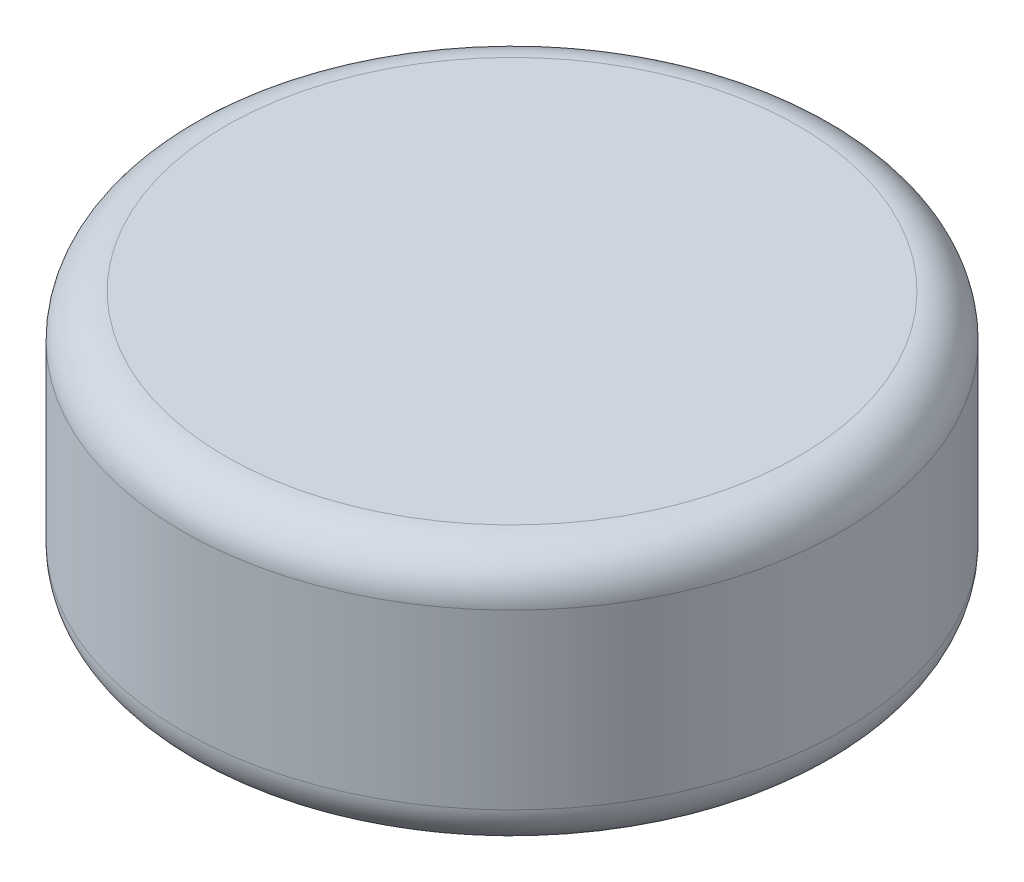
ISO-10303-21;
HEADER;
FILE_DESCRIPTION(('STEP AP214'),'2;1');
FILE_NAME('part.step','',(''),(''),'','','');
FILE_SCHEMA(('AUTOMOTIVE_DESIGN { 1 0 10303 214 1 1 1 1 }'));
ENDSEC;
DATA;
#1=APPLICATION_CONTEXT('core data for automotive mechanical design processes');
#2=APPLICATION_PROTOCOL_DEFINITION('international standard','automotive_design',2000,#1);
#3=PRODUCT_CONTEXT('',#1,'mechanical');
#4=PRODUCT('Part','Part','',(#3));
#5=PRODUCT_RELATED_PRODUCT_CATEGORY('part','',(#4));
#6=PRODUCT_DEFINITION_FORMATION('','',#4);
#7=PRODUCT_DEFINITION_CONTEXT('part definition',#1,'design');
#8=PRODUCT_DEFINITION('design','',#6,#7);
#9=PRODUCT_DEFINITION_SHAPE('','',#8);
#10=(LENGTH_UNIT() NAMED_UNIT(*) SI_UNIT(.MILLI.,.METRE.));
#11=(NAMED_UNIT(*) PLANE_ANGLE_UNIT() SI_UNIT($,.RADIAN.));
#12=(NAMED_UNIT(*) SI_UNIT($,.STERADIAN.) SOLID_ANGLE_UNIT());
#13=UNCERTAINTY_MEASURE_WITH_UNIT(LENGTH_MEASURE(1.E-05),#10,'distance_accuracy_value','');
#14=(GEOMETRIC_REPRESENTATION_CONTEXT(3) GLOBAL_UNCERTAINTY_ASSIGNED_CONTEXT((#13)) GLOBAL_UNIT_ASSIGNED_CONTEXT((#10,
#11,#12)) REPRESENTATION_CONTEXT('',''));
#15=CARTESIAN_POINT('',(0.,0.,0.));
#16=DIRECTION('',(0.,0.,1.));
#17=DIRECTION('',(1.,0.,0.));
#18=AXIS2_PLACEMENT_3D('',#15,#16,#17);
#19=CARTESIAN_POINT('',(0.,60.,0.));
#20=DIRECTION('',(0.,-1.,0.));
#21=DIRECTION('',(0.,0.,-1.));
#22=AXIS2_PLACEMENT_3D('',#19,#20,#21);
#23=CYLINDRICAL_SURFACE('',#22,76.2);
#24=CARTESIAN_POINT('',(0.,10.,0.));
#25=DIRECTION('',(0.,1.,0.));
#26=DIRECTION('',(0.,0.,1.));
#27=AXIS2_PLACEMENT_3D('',#24,#25,#26);
#28=CIRCLE('',#27,76.2);
#29=CARTESIAN_POINT('',(0.,10.,76.2));
#30=VERTEX_POINT('',#29);
#31=EDGE_CURVE('E42',#30,#30,#28,.T.);
#32=ORIENTED_EDGE('',*,*,#31,.T.);
#33=EDGE_LOOP('',(#32));
#34=FACE_BOUND('',#33,.T.);
#35=CARTESIAN_POINT('',(0.,50.,0.));
#36=DIRECTION('',(0.,1.,0.));
#37=DIRECTION('',(0.,0.,1.));
#38=AXIS2_PLACEMENT_3D('',#35,#36,#37);
#39=CIRCLE('',#38,76.2);
#40=CARTESIAN_POINT('',(0.,50.,76.2));
#41=VERTEX_POINT('',#40);
#42=EDGE_CURVE('E46',#41,#41,#39,.F.);
#43=ORIENTED_EDGE('',*,*,#42,.T.);
#44=EDGE_LOOP('',(#43));
#45=FACE_BOUND('',#44,.T.);
#46=ADVANCED_FACE('F31',(#34,#45),#23,.T.);
#47=CARTESIAN_POINT('',(0.,60.,0.));
#48=DIRECTION('',(0.,1.,0.));
#49=DIRECTION('',(0.,0.,1.));
#50=AXIS2_PLACEMENT_3D('',#47,#48,#49);
#51=PLANE('',#50);
#52=CARTESIAN_POINT('',(0.,60.,0.));
#53=DIRECTION('',(0.,1.,0.));
#54=DIRECTION('',(0.,0.,1.));
#55=AXIS2_PLACEMENT_3D('',#52,#53,#54);
#56=CIRCLE('',#55,66.2);
#57=CARTESIAN_POINT('',(0.,60.,66.2));
#58=VERTEX_POINT('',#57);
#59=EDGE_CURVE('E10',#58,#58,#56,.T.);
#60=ORIENTED_EDGE('',*,*,#59,.T.);
#61=EDGE_LOOP('',(#60));
#62=FACE_BOUND('',#61,.T.);
#63=ADVANCED_FACE('F62',(#62),#51,.T.);
#64=CARTESIAN_POINT('',(0.,0.,0.));
#65=DIRECTION('',(0.,1.,0.));
#66=DIRECTION('',(0.,0.,1.));
#67=AXIS2_PLACEMENT_3D('',#64,#65,#66);
#68=PLANE('',#67);
#69=CARTESIAN_POINT('',(0.,0.,0.));
#70=DIRECTION('',(0.,1.,0.));
#71=DIRECTION('',(0.,0.,1.));
#72=AXIS2_PLACEMENT_3D('',#69,#70,#71);
#73=CIRCLE('',#72,66.2);
#74=CARTESIAN_POINT('',(0.,0.,66.2));
#75=VERTEX_POINT('',#74);
#76=EDGE_CURVE('E38',#75,#75,#73,.F.);
#77=ORIENTED_EDGE('',*,*,#76,.T.);
#78=EDGE_LOOP('',(#77));
#79=FACE_BOUND('',#78,.T.);
#80=ADVANCED_FACE('F59',(#79),#68,.F.);
#81=CARTESIAN_POINT('',(0.,10.,0.));
#82=DIRECTION('',(0.,1.,0.));
#83=DIRECTION('',(0.,0.,1.));
#84=AXIS2_PLACEMENT_3D('',#81,#82,#83);
#85=TOROIDAL_SURFACE('',#84,66.2,10.);
#86=ORIENTED_EDGE('',*,*,#76,.F.);
#87=EDGE_LOOP('',(#86));
#88=FACE_BOUND('',#87,.T.);
#89=ORIENTED_EDGE('',*,*,#31,.F.);
#90=EDGE_LOOP('',(#89));
#91=FACE_BOUND('',#90,.T.);
#92=ADVANCED_FACE('F55',(#88,#91),#85,.T.);
#93=CARTESIAN_POINT('',(0.,50.,0.));
#94=DIRECTION('',(0.,1.,0.));
#95=DIRECTION('',(0.,0.,1.));
#96=AXIS2_PLACEMENT_3D('',#93,#94,#95);
#97=TOROIDAL_SURFACE('',#96,66.2,10.);
#98=ORIENTED_EDGE('',*,*,#42,.F.);
#99=EDGE_LOOP('',(#98));
#100=FACE_BOUND('',#99,.T.);
#101=ORIENTED_EDGE('',*,*,#59,.F.);
#102=EDGE_LOOP('',(#101));
#103=FACE_BOUND('',#102,.T.);
#104=ADVANCED_FACE('F33',(#100,#103),#97,.T.);
#105=CLOSED_SHELL('',(#46,#63,#80,#92,#104));
#106=MANIFOLD_SOLID_BREP('B2',#105);
#107=ADVANCED_BREP_SHAPE_REPRESENTATION('',(#18,#106),#14);
#108=SHAPE_DEFINITION_REPRESENTATION(#9,#107);
ENDSEC;
END-ISO-10303-21;
